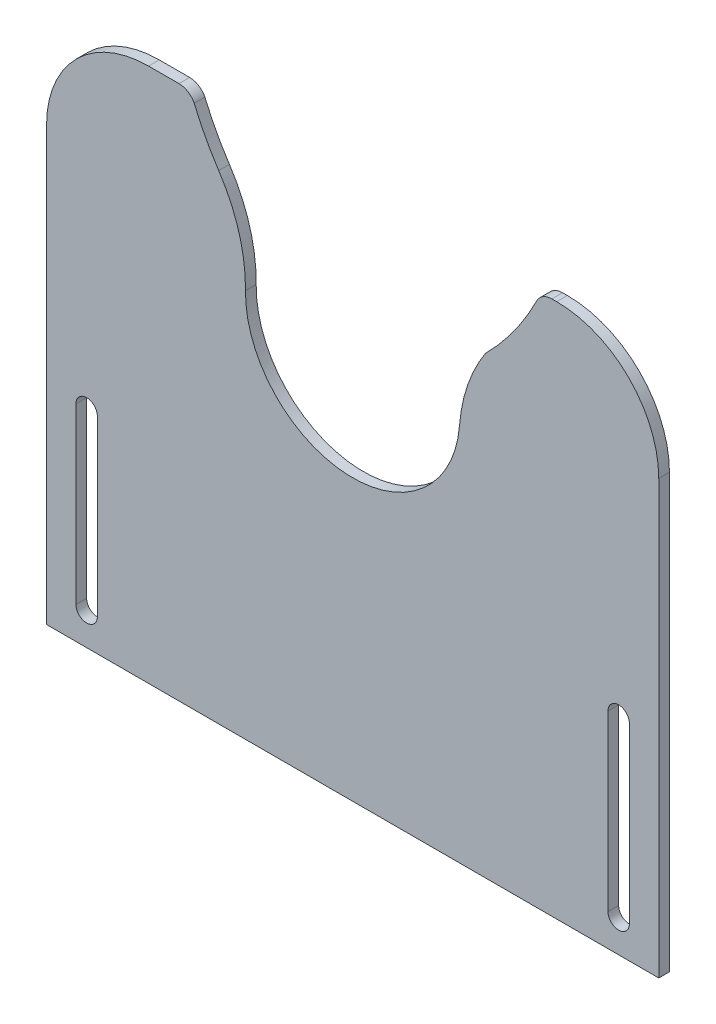
ISO-10303-21;
HEADER;
FILE_DESCRIPTION(('STEP AP214'),'2;1');
FILE_NAME('part.step','',(''),(''),'','','');
FILE_SCHEMA(('AUTOMOTIVE_DESIGN { 1 0 10303 214 1 1 1 1 }'));
ENDSEC;
DATA;
#1=APPLICATION_CONTEXT('core data for automotive mechanical design processes');
#2=APPLICATION_PROTOCOL_DEFINITION('international standard','automotive_design',2000,#1);
#3=PRODUCT_CONTEXT('',#1,'mechanical');
#4=PRODUCT('Part','Part','',(#3));
#5=PRODUCT_RELATED_PRODUCT_CATEGORY('part','',(#4));
#6=PRODUCT_DEFINITION_FORMATION('','',#4);
#7=PRODUCT_DEFINITION_CONTEXT('part definition',#1,'design');
#8=PRODUCT_DEFINITION('design','',#6,#7);
#9=PRODUCT_DEFINITION_SHAPE('','',#8);
#10=(LENGTH_UNIT() NAMED_UNIT(*) SI_UNIT(.MILLI.,.METRE.));
#11=(NAMED_UNIT(*) PLANE_ANGLE_UNIT() SI_UNIT($,.RADIAN.));
#12=(NAMED_UNIT(*) SI_UNIT($,.STERADIAN.) SOLID_ANGLE_UNIT());
#13=UNCERTAINTY_MEASURE_WITH_UNIT(LENGTH_MEASURE(1.E-05),#10,'distance_accuracy_value','');
#14=(GEOMETRIC_REPRESENTATION_CONTEXT(3) GLOBAL_UNCERTAINTY_ASSIGNED_CONTEXT((#13)) GLOBAL_UNIT_ASSIGNED_CONTEXT((#10,
#11,#12)) REPRESENTATION_CONTEXT('',''));
#15=CARTESIAN_POINT('',(0.,0.,0.));
#16=DIRECTION('',(0.,0.,1.));
#17=DIRECTION('',(1.,0.,0.));
#18=AXIS2_PLACEMENT_3D('',#15,#16,#17);
#19=CARTESIAN_POINT('',(76.3333333333333,28.1230553451277,4.));
#20=DIRECTION('',(0.,0.,-1.));
#21=DIRECTION('',(-1.,0.,0.));
#22=AXIS2_PLACEMENT_3D('',#19,#20,#21);
#23=CYLINDRICAL_SURFACE('',#22,38.1666666666667);
#24=CARTESIAN_POINT('',(76.3333333333333,28.1230553451277,0.));
#25=DIRECTION('',(0.,0.,1.));
#26=DIRECTION('',(1.,0.,0.));
#27=AXIS2_PLACEMENT_3D('',#24,#25,#26);
#28=CIRCLE('',#27,38.1666666666667);
#29=CARTESIAN_POINT('',(114.5,28.1230553451277,0.));
#30=VERTEX_POINT('',#29);
#31=CARTESIAN_POINT('',(76.3333284687407,66.2897220117941,0.));
#32=VERTEX_POINT('',#31);
#33=EDGE_CURVE('E216',#30,#32,#28,.T.);
#34=ORIENTED_EDGE('',*,*,#33,.T.);
#35=DIRECTION('',(0.,0.,-1.));
#36=VECTOR('',#35,1.);
#37=CARTESIAN_POINT('',(76.3333284687407,66.2897220117941,4.));
#38=LINE('',#37,#36);
#39=CARTESIAN_POINT('',(76.3333284687407,66.2897220117941,4.));
#40=VERTEX_POINT('',#39);
#41=EDGE_CURVE('E316',#40,#32,#38,.T.);
#42=ORIENTED_EDGE('',*,*,#41,.F.);
#43=CARTESIAN_POINT('',(76.3333333333333,28.1230553451277,4.));
#44=DIRECTION('',(0.,0.,1.));
#45=DIRECTION('',(1.,0.,0.));
#46=AXIS2_PLACEMENT_3D('',#43,#44,#45);
#47=CIRCLE('',#46,38.1666666666667);
#48=CARTESIAN_POINT('',(114.5,28.1230553451277,4.));
#49=VERTEX_POINT('',#48);
#50=EDGE_CURVE('E240',#49,#40,#47,.T.);
#51=ORIENTED_EDGE('',*,*,#50,.F.);
#52=DIRECTION('',(0.,0.,-1.));
#53=VECTOR('',#52,1.);
#54=CARTESIAN_POINT('',(114.5,28.1230553451277,4.));
#55=LINE('',#54,#53);
#56=EDGE_CURVE('E264',#49,#30,#55,.T.);
#57=ORIENTED_EDGE('',*,*,#56,.T.);
#58=EDGE_LOOP('',(#34,#42,#51,#57));
#59=FACE_BOUND('',#58,.T.);
#60=ADVANCED_FACE('F35',(#59),#23,.T.);
#61=CARTESIAN_POINT('',(76.3333284687407,66.2897220117941,4.));
#62=DIRECTION('',(0.,-1.,0.));
#63=DIRECTION('',(0.,0.,-1.));
#64=AXIS2_PLACEMENT_3D('',#61,#62,#63);
#65=PLANE('',#64);
#66=DIRECTION('',(-1.,0.,0.));
#67=VECTOR('',#66,1.);
#68=CARTESIAN_POINT('',(76.3333284687407,66.2897220117941,0.));
#69=LINE('',#68,#67);
#70=CARTESIAN_POINT('',(74.5052518625463,66.2897220117941,0.));
#71=VERTEX_POINT('',#70);
#72=EDGE_CURVE('E267',#32,#71,#69,.T.);
#73=ORIENTED_EDGE('',*,*,#72,.T.);
#74=DIRECTION('',(0.,0.,-1.));
#75=VECTOR('',#74,1.);
#76=CARTESIAN_POINT('',(74.5052518625463,66.2897220117941,4.));
#77=LINE('',#76,#75);
#78=CARTESIAN_POINT('',(74.5052518625463,66.2897220117941,4.));
#79=VERTEX_POINT('',#78);
#80=EDGE_CURVE('E313',#79,#71,#77,.T.);
#81=ORIENTED_EDGE('',*,*,#80,.F.);
#82=DIRECTION('',(-1.,0.,0.));
#83=VECTOR('',#82,1.);
#84=CARTESIAN_POINT('',(76.3333284687407,66.2897220117941,4.));
#85=LINE('',#84,#83);
#86=EDGE_CURVE('E243',#40,#79,#85,.T.);
#87=ORIENTED_EDGE('',*,*,#86,.F.);
#88=ORIENTED_EDGE('',*,*,#41,.T.);
#89=EDGE_LOOP('',(#73,#81,#87,#88));
#90=FACE_BOUND('',#89,.T.);
#91=ADVANCED_FACE('F372',(#90),#65,.F.);
#92=CARTESIAN_POINT('',(74.5052518625463,59.928610900683,4.));
#93=DIRECTION('',(0.,0.,-1.));
#94=DIRECTION('',(-1.,0.,0.));
#95=AXIS2_PLACEMENT_3D('',#92,#93,#94);
#96=CYLINDRICAL_SURFACE('',#95,6.36111111111112);
#97=CARTESIAN_POINT('',(74.5052518625463,59.928610900683,0.));
#98=DIRECTION('',(0.,0.,1.));
#99=DIRECTION('',(1.,0.,0.));
#100=AXIS2_PLACEMENT_3D('',#97,#98,#99);
#101=CIRCLE('',#100,6.36111111111112);
#102=CARTESIAN_POINT('',(68.8157029090702,62.7733898506017,0.));
#103=VERTEX_POINT('',#102);
#104=EDGE_CURVE('E269',#71,#103,#101,.T.);
#105=ORIENTED_EDGE('',*,*,#104,.T.);
#106=DIRECTION('',(0.,0.,-1.));
#107=VECTOR('',#106,1.);
#108=CARTESIAN_POINT('',(68.8157029090702,62.7733898506017,4.));
#109=LINE('',#108,#107);
#110=CARTESIAN_POINT('',(68.8157029090702,62.7733898506017,4.));
#111=VERTEX_POINT('',#110);
#112=EDGE_CURVE('E310',#111,#103,#109,.T.);
#113=ORIENTED_EDGE('',*,*,#112,.F.);
#114=CARTESIAN_POINT('',(74.5052518625463,59.928610900683,4.));
#115=DIRECTION('',(0.,0.,1.));
#116=DIRECTION('',(1.,0.,0.));
#117=AXIS2_PLACEMENT_3D('',#114,#115,#116);
#118=CIRCLE('',#117,6.36111111111112);
#119=EDGE_CURVE('E246',#79,#111,#118,.T.);
#120=ORIENTED_EDGE('',*,*,#119,.F.);
#121=ORIENTED_EDGE('',*,*,#80,.T.);
#122=EDGE_LOOP('',(#105,#113,#120,#121));
#123=FACE_BOUND('',#122,.T.);
#124=ADVANCED_FACE('F368',(#123),#96,.T.);
#125=CARTESIAN_POINT('',(-22.2170803465471,108.289853049303,4.));
#126=DIRECTION('',(0.,0.,-1.));
#127=DIRECTION('',(-1.,0.,0.));
#128=AXIS2_PLACEMENT_3D('',#125,#126,#127);
#129=CYLINDRICAL_SURFACE('',#128,101.777777777779);
#130=CARTESIAN_POINT('',(-22.2170803465471,108.289853049303,0.));
#131=DIRECTION('',(0.,0.,-1.));
#132=DIRECTION('',(1.,0.,0.));
#133=AXIS2_PLACEMENT_3D('',#130,#131,#132);
#134=CIRCLE('',#133,101.777777777779);
#135=CARTESIAN_POINT('',(49.7506764942186,36.3220962085389,0.));
#136=VERTEX_POINT('',#135);
#137=EDGE_CURVE('E271',#103,#136,#134,.T.);
#138=ORIENTED_EDGE('',*,*,#137,.T.);
#139=DIRECTION('',(0.,0.,-1.));
#140=VECTOR('',#139,1.);
#141=CARTESIAN_POINT('',(49.7506764942186,36.3220962085389,4.));
#142=LINE('',#141,#140);
#143=CARTESIAN_POINT('',(49.7506764942186,36.3220962085389,4.));
#144=VERTEX_POINT('',#143);
#145=EDGE_CURVE('E307',#144,#136,#142,.T.);
#146=ORIENTED_EDGE('',*,*,#145,.F.);
#147=CARTESIAN_POINT('',(-22.2170803465471,108.289853049303,4.));
#148=DIRECTION('',(0.,0.,-1.));
#149=DIRECTION('',(1.,0.,0.));
#150=AXIS2_PLACEMENT_3D('',#147,#148,#149);
#151=CIRCLE('',#150,101.777777777779);
#152=EDGE_CURVE('E248',#111,#144,#151,.T.);
#153=ORIENTED_EDGE('',*,*,#152,.F.);
#154=ORIENTED_EDGE('',*,*,#112,.T.);
#155=EDGE_LOOP('',(#138,#146,#153,#154));
#156=FACE_BOUND('',#155,.T.);
#157=ADVANCED_FACE('F363',(#156),#129,.F.);
#158=CARTESIAN_POINT('',(34.7025783160391,101.851646896905,4.));
#159=DIRECTION('',(0.,0.,-1.));
#160=DIRECTION('',(-1.,0.,0.));
#161=AXIS2_PLACEMENT_3D('',#158,#159,#160);
#162=CYLINDRICAL_SURFACE('',#161,101.777777777777);
#163=CARTESIAN_POINT('',(34.7025783160391,101.851646896905,4.));
#164=DIRECTION('',(0.,0.,-1.));
#165=DIRECTION('',(1.,0.,0.));
#166=AXIS2_PLACEMENT_3D('',#163,#164,#165);
#167=CIRCLE('',#166,101.777777777777);
#168=CARTESIAN_POINT('',(-50.0945508826811,45.5652104398137,4.));
#169=VERTEX_POINT('',#168);
#170=CARTESIAN_POINT('',(-59.2740458628787,62.7733900612031,4.));
#171=VERTEX_POINT('',#170);
#172=EDGE_CURVE('E250',#169,#171,#167,.T.);
#173=ORIENTED_EDGE('',*,*,#172,.F.);
#174=DIRECTION('',(0.,0.,-1.));
#175=VECTOR('',#174,1.);
#176=CARTESIAN_POINT('',(-50.0945508826811,45.5652104398137,4.));
#177=LINE('',#176,#175);
#178=CARTESIAN_POINT('',(-50.0945508826811,45.5652104398137,0.));
#179=VERTEX_POINT('',#178);
#180=EDGE_CURVE('E343',#169,#179,#177,.T.);
#181=ORIENTED_EDGE('',*,*,#180,.T.);
#182=CARTESIAN_POINT('',(34.7025783160391,101.851646896905,0.));
#183=DIRECTION('',(0.,0.,-1.));
#184=DIRECTION('',(1.,0.,0.));
#185=AXIS2_PLACEMENT_3D('',#182,#183,#184);
#186=CIRCLE('',#185,101.777777777777);
#187=CARTESIAN_POINT('',(-59.2740458628787,62.7733900612031,0.));
#188=VERTEX_POINT('',#187);
#189=EDGE_CURVE('E274',#179,#188,#186,.T.);
#190=ORIENTED_EDGE('',*,*,#189,.T.);
#191=DIRECTION('',(0.,0.,-1.));
#192=VECTOR('',#191,1.);
#193=CARTESIAN_POINT('',(-59.2740458628787,62.7733900612031,4.));
#194=LINE('',#193,#192);
#195=EDGE_CURVE('E304',#171,#188,#194,.T.);
#196=ORIENTED_EDGE('',*,*,#195,.F.);
#197=EDGE_LOOP('',(#173,#181,#190,#196));
#198=FACE_BOUND('',#197,.T.);
#199=ADVANCED_FACE('F409',(#198),#162,.F.);
#200=CARTESIAN_POINT('',(-64.9635947110538,59.9286109006831,4.));
#201=DIRECTION('',(0.,0.,-1.));
#202=DIRECTION('',(-1.,0.,0.));
#203=AXIS2_PLACEMENT_3D('',#200,#201,#202);
#204=CYLINDRICAL_SURFACE('',#203,6.36111111111103);
#205=CARTESIAN_POINT('',(-64.9635947110538,59.9286109006831,0.));
#206=DIRECTION('',(0.,0.,1.));
#207=DIRECTION('',(1.,0.,0.));
#208=AXIS2_PLACEMENT_3D('',#205,#206,#207);
#209=CIRCLE('',#208,6.36111111111103);
#210=CARTESIAN_POINT('',(-64.9635947110538,66.2897220117941,0.));
#211=VERTEX_POINT('',#210);
#212=EDGE_CURVE('E276',#188,#211,#209,.T.);
#213=ORIENTED_EDGE('',*,*,#212,.T.);
#214=DIRECTION('',(0.,0.,-1.));
#215=VECTOR('',#214,1.);
#216=CARTESIAN_POINT('',(-64.9635947110538,66.2897220117941,4.));
#217=LINE('',#216,#215);
#218=CARTESIAN_POINT('',(-64.9635947110538,66.2897220117941,4.));
#219=VERTEX_POINT('',#218);
#220=EDGE_CURVE('E301',#219,#211,#217,.T.);
#221=ORIENTED_EDGE('',*,*,#220,.F.);
#222=CARTESIAN_POINT('',(-64.9635947110538,59.9286109006831,4.));
#223=DIRECTION('',(0.,0.,1.));
#224=DIRECTION('',(1.,0.,0.));
#225=AXIS2_PLACEMENT_3D('',#222,#223,#224);
#226=CIRCLE('',#225,6.36111111111103);
#227=EDGE_CURVE('E252',#171,#219,#226,.T.);
#228=ORIENTED_EDGE('',*,*,#227,.F.);
#229=ORIENTED_EDGE('',*,*,#195,.T.);
#230=EDGE_LOOP('',(#213,#221,#228,#229));
#231=FACE_BOUND('',#230,.T.);
#232=ADVANCED_FACE('F405',(#231),#204,.T.);
#233=CARTESIAN_POINT('',(-64.9635947110538,66.2897220117941,4.));
#234=DIRECTION('',(0.,-1.,0.));
#235=DIRECTION('',(0.,0.,-1.));
#236=AXIS2_PLACEMENT_3D('',#233,#234,#235);
#237=PLANE('',#236);
#238=DIRECTION('',(-1.,0.,0.));
#239=VECTOR('',#238,1.);
#240=CARTESIAN_POINT('',(-64.9635947110538,66.2897220117941,0.));
#241=LINE('',#240,#239);
#242=CARTESIAN_POINT('',(-76.3333368066178,66.2897220117941,0.));
#243=VERTEX_POINT('',#242);
#244=EDGE_CURVE('E278',#211,#243,#241,.T.);
#245=ORIENTED_EDGE('',*,*,#244,.T.);
#246=DIRECTION('',(0.,0.,-1.));
#247=VECTOR('',#246,1.);
#248=CARTESIAN_POINT('',(-76.3333368066178,66.2897220117941,4.));
#249=LINE('',#248,#247);
#250=CARTESIAN_POINT('',(-76.3333368066178,66.2897220117941,4.));
#251=VERTEX_POINT('',#250);
#252=EDGE_CURVE('E298',#251,#243,#249,.T.);
#253=ORIENTED_EDGE('',*,*,#252,.F.);
#254=DIRECTION('',(-1.,0.,0.));
#255=VECTOR('',#254,1.);
#256=CARTESIAN_POINT('',(-64.9635947110538,66.2897220117941,4.));
#257=LINE('',#256,#255);
#258=EDGE_CURVE('E254',#219,#251,#257,.T.);
#259=ORIENTED_EDGE('',*,*,#258,.F.);
#260=ORIENTED_EDGE('',*,*,#220,.T.);
#261=EDGE_LOOP('',(#245,#253,#259,#260));
#262=FACE_BOUND('',#261,.T.);
#263=ADVANCED_FACE('F401',(#262),#237,.F.);
#264=CARTESIAN_POINT('',(-76.3333333333334,28.1230553451276,4.));
#265=DIRECTION('',(0.,0.,-1.));
#266=DIRECTION('',(-1.,0.,0.));
#267=AXIS2_PLACEMENT_3D('',#264,#265,#266);
#268=CYLINDRICAL_SURFACE('',#267,38.1666666666666);
#269=CARTESIAN_POINT('',(-76.3333333333334,28.1230553451276,0.));
#270=DIRECTION('',(0.,0.,1.));
#271=DIRECTION('',(1.,0.,0.));
#272=AXIS2_PLACEMENT_3D('',#269,#270,#271);
#273=CIRCLE('',#272,38.1666666666666);
#274=CARTESIAN_POINT('',(-114.5,28.1230553451276,0.));
#275=VERTEX_POINT('',#274);
#276=EDGE_CURVE('E280',#243,#275,#273,.T.);
#277=ORIENTED_EDGE('',*,*,#276,.T.);
#278=DIRECTION('',(0.,0.,-1.));
#279=VECTOR('',#278,1.);
#280=CARTESIAN_POINT('',(-114.5,28.1230553451276,4.));
#281=LINE('',#280,#279);
#282=CARTESIAN_POINT('',(-114.5,28.1230553451276,4.));
#283=VERTEX_POINT('',#282);
#284=EDGE_CURVE('E295',#283,#275,#281,.T.);
#285=ORIENTED_EDGE('',*,*,#284,.F.);
#286=CARTESIAN_POINT('',(-76.3333333333334,28.1230553451276,4.));
#287=DIRECTION('',(0.,0.,1.));
#288=DIRECTION('',(1.,0.,0.));
#289=AXIS2_PLACEMENT_3D('',#286,#287,#288);
#290=CIRCLE('',#289,38.1666666666666);
#291=EDGE_CURVE('E256',#251,#283,#290,.T.);
#292=ORIENTED_EDGE('',*,*,#291,.F.);
#293=ORIENTED_EDGE('',*,*,#252,.T.);
#294=EDGE_LOOP('',(#277,#285,#292,#293));
#295=FACE_BOUND('',#294,.T.);
#296=ADVANCED_FACE('F396',(#295),#268,.T.);
#297=CARTESIAN_POINT('',(-114.5,28.1230553451276,4.));
#298=DIRECTION('',(1.,0.,0.));
#299=DIRECTION('',(0.,1.,0.));
#300=AXIS2_PLACEMENT_3D('',#297,#298,#299);
#301=PLANE('',#300);
#302=DIRECTION('',(0.,-1.,0.));
#303=VECTOR('',#302,1.);
#304=CARTESIAN_POINT('',(-114.5,28.1230553451276,0.));
#305=LINE('',#304,#303);
#306=CARTESIAN_POINT('',(-114.5,-133.710277988206,0.));
#307=VERTEX_POINT('',#306);
#308=EDGE_CURVE('E282',#275,#307,#305,.T.);
#309=ORIENTED_EDGE('',*,*,#308,.T.);
#310=DIRECTION('',(0.,0.,-1.));
#311=VECTOR('',#310,1.);
#312=CARTESIAN_POINT('',(-114.5,-133.710277988206,4.));
#313=LINE('',#312,#311);
#314=CARTESIAN_POINT('',(-114.5,-133.710277988206,4.));
#315=VERTEX_POINT('',#314);
#316=EDGE_CURVE('E292',#315,#307,#313,.T.);
#317=ORIENTED_EDGE('',*,*,#316,.F.);
#318=DIRECTION('',(0.,-1.,0.));
#319=VECTOR('',#318,1.);
#320=CARTESIAN_POINT('',(-114.5,28.1230553451276,4.));
#321=LINE('',#320,#319);
#322=EDGE_CURVE('E258',#283,#315,#321,.T.);
#323=ORIENTED_EDGE('',*,*,#322,.F.);
#324=ORIENTED_EDGE('',*,*,#284,.T.);
#325=EDGE_LOOP('',(#309,#317,#323,#324));
#326=FACE_BOUND('',#325,.T.);
#327=ADVANCED_FACE('F390',(#326),#301,.F.);
#328=CARTESIAN_POINT('',(-114.5,-133.710277988206,4.));
#329=DIRECTION('',(0.,1.,0.));
#330=DIRECTION('',(0.,0.,1.));
#331=AXIS2_PLACEMENT_3D('',#328,#329,#330);
#332=PLANE('',#331);
#333=DIRECTION('',(1.,0.,0.));
#334=VECTOR('',#333,1.);
#335=CARTESIAN_POINT('',(-114.5,-133.710277988206,0.));
#336=LINE('',#335,#334);
#337=CARTESIAN_POINT('',(114.5,-133.710277988206,0.));
#338=VERTEX_POINT('',#337);
#339=EDGE_CURVE('E284',#307,#338,#336,.T.);
#340=ORIENTED_EDGE('',*,*,#339,.T.);
#341=DIRECTION('',(0.,0.,-1.));
#342=VECTOR('',#341,1.);
#343=CARTESIAN_POINT('',(114.5,-133.710277988206,4.));
#344=LINE('',#343,#342);
#345=CARTESIAN_POINT('',(114.5,-133.710277988206,4.));
#346=VERTEX_POINT('',#345);
#347=EDGE_CURVE('E289',#346,#338,#344,.T.);
#348=ORIENTED_EDGE('',*,*,#347,.F.);
#349=DIRECTION('',(1.,0.,0.));
#350=VECTOR('',#349,1.);
#351=CARTESIAN_POINT('',(-114.5,-133.710277988206,4.));
#352=LINE('',#351,#350);
#353=EDGE_CURVE('E260',#315,#346,#352,.T.);
#354=ORIENTED_EDGE('',*,*,#353,.F.);
#355=ORIENTED_EDGE('',*,*,#316,.T.);
#356=EDGE_LOOP('',(#340,#348,#354,#355));
#357=FACE_BOUND('',#356,.T.);
#358=ADVANCED_FACE('F386',(#357),#332,.F.);
#359=CARTESIAN_POINT('',(114.5,-133.710277988206,4.));
#360=DIRECTION('',(-1.,0.,0.));
#361=DIRECTION('',(0.,-1.,0.));
#362=AXIS2_PLACEMENT_3D('',#359,#360,#361);
#363=PLANE('',#362);
#364=DIRECTION('',(0.,1.,0.));
#365=VECTOR('',#364,1.);
#366=CARTESIAN_POINT('',(114.5,-133.710277988206,0.));
#367=LINE('',#366,#365);
#368=EDGE_CURVE('E244',#338,#30,#367,.T.);
#369=ORIENTED_EDGE('',*,*,#368,.T.);
#370=ORIENTED_EDGE('',*,*,#56,.F.);
#371=DIRECTION('',(0.,1.,0.));
#372=VECTOR('',#371,1.);
#373=CARTESIAN_POINT('',(114.5,-133.710277988206,4.));
#374=LINE('',#373,#372);
#375=EDGE_CURVE('E262',#346,#49,#374,.T.);
#376=ORIENTED_EDGE('',*,*,#375,.F.);
#377=ORIENTED_EDGE('',*,*,#347,.T.);
#378=EDGE_LOOP('',(#369,#370,#376,#377));
#379=FACE_BOUND('',#378,.T.);
#380=ADVANCED_FACE('F381',(#379),#363,.F.);
#381=CARTESIAN_POINT('',(76.3333333333333,28.1230553451277,4.));
#382=DIRECTION('',(0.,0.,1.));
#383=DIRECTION('',(1.,0.,0.));
#384=AXIS2_PLACEMENT_3D('',#381,#382,#383);
#385=PLANE('',#384);
#386=CARTESIAN_POINT('',(-1.21616608461713E-06,11.1658275297556,4.));
#387=DIRECTION('',(0.,0.,1.));
#388=DIRECTION('',(1.,0.,0.));
#389=AXIS2_PLACEMENT_3D('',#386,#387,#388);
#390=CIRCLE('',#389,40.09152773397);
#391=CARTESIAN_POINT('',(-40.0885632535085,11.6534645072589,4.));
#392=VERTEX_POINT('',#391);
#393=CARTESIAN_POINT('',(39.9640342405793,7.97107150531764,4.));
#394=VERTEX_POINT('',#393);
#395=EDGE_CURVE('E222',#392,#394,#390,.T.);
#396=ORIENTED_EDGE('',*,*,#395,.F.);
#397=CARTESIAN_POINT('',(-100.08412486446,12.3832500830129,4.));
#398=DIRECTION('',(0.,0.,1.));
#399=DIRECTION('',(1.,0.,0.));
#400=AXIS2_PLACEMENT_3D('',#397,#398,#399);
#401=CIRCLE('',#400,60.);
#402=EDGE_CURVE('E11',#392,#169,#401,.T.);
#403=ORIENTED_EDGE('',*,*,#402,.T.);
#404=ORIENTED_EDGE('',*,*,#172,.T.);
#405=ORIENTED_EDGE('',*,*,#227,.T.);
#406=ORIENTED_EDGE('',*,*,#258,.T.);
#407=ORIENTED_EDGE('',*,*,#291,.T.);
#408=ORIENTED_EDGE('',*,*,#322,.T.);
#409=ORIENTED_EDGE('',*,*,#353,.T.);
#410=ORIENTED_EDGE('',*,*,#375,.T.);
#411=ORIENTED_EDGE('',*,*,#50,.T.);
#412=ORIENTED_EDGE('',*,*,#86,.T.);
#413=ORIENTED_EDGE('',*,*,#119,.T.);
#414=ORIENTED_EDGE('',*,*,#152,.T.);
#415=CARTESIAN_POINT('',(99.7732324162079,3.18987776438011,4.));
#416=DIRECTION('',(0.,0.,1.));
#417=DIRECTION('',(1.,0.,0.));
#418=AXIS2_PLACEMENT_3D('',#415,#416,#417);
#419=CIRCLE('',#418,60.);
#420=EDGE_CURVE('E43',#144,#394,#419,.T.);
#421=ORIENTED_EDGE('',*,*,#420,.T.);
#422=EDGE_LOOP('',(#396,#403,#404,#405,#406,#407,#408,#409,#410,#411,#412,#413,#414,#421));
#423=FACE_BOUND('',#422,.T.);
#424=CARTESIAN_POINT('',(-99.5000015693326,-56.7102779882059,4.));
#425=DIRECTION('',(0.,0.,1.));
#426=DIRECTION('',(1.,0.,0.));
#427=AXIS2_PLACEMENT_3D('',#424,#425,#426);
#428=CIRCLE('',#427,4.);
#429=CARTESIAN_POINT('',(-95.5000015693327,-56.7102779882059,4.));
#430=VERTEX_POINT('',#429);
#431=CARTESIAN_POINT('',(-103.500001569333,-56.7102779882059,4.));
#432=VERTEX_POINT('',#431);
#433=EDGE_CURVE('E204',#430,#432,#428,.T.);
#434=ORIENTED_EDGE('',*,*,#433,.F.);
#435=DIRECTION('',(0.,1.,0.));
#436=VECTOR('',#435,1.);
#437=CARTESIAN_POINT('',(-95.5000015693327,-56.7102779882059,4.));
#438=LINE('',#437,#436);
#439=CARTESIAN_POINT('',(-95.5000015693327,-121.710277988206,4.));
#440=VERTEX_POINT('',#439);
#441=EDGE_CURVE('E209',#440,#430,#438,.T.);
#442=ORIENTED_EDGE('',*,*,#441,.F.);
#443=CARTESIAN_POINT('',(-99.5000015693326,-121.710277988206,4.));
#444=DIRECTION('',(0.,0.,1.));
#445=DIRECTION('',(1.,0.,0.));
#446=AXIS2_PLACEMENT_3D('',#443,#444,#445);
#447=CIRCLE('',#446,3.99999999999996);
#448=CARTESIAN_POINT('',(-103.500001569333,-121.710277988206,4.));
#449=VERTEX_POINT('',#448);
#450=EDGE_CURVE('E188',#449,#440,#447,.T.);
#451=ORIENTED_EDGE('',*,*,#450,.F.);
#452=DIRECTION('',(0.,-1.,0.));
#453=VECTOR('',#452,1.);
#454=CARTESIAN_POINT('',(-103.500001569333,-56.7102779882059,4.));
#455=LINE('',#454,#453);
#456=EDGE_CURVE('E199',#432,#449,#455,.T.);
#457=ORIENTED_EDGE('',*,*,#456,.F.);
#458=EDGE_LOOP('',(#434,#442,#451,#457));
#459=FACE_BOUND('',#458,.T.);
#460=CARTESIAN_POINT('',(99.5000015693326,-56.7102779882059,4.));
#461=DIRECTION('',(0.,0.,1.));
#462=DIRECTION('',(-1.,0.,0.));
#463=AXIS2_PLACEMENT_3D('',#460,#461,#462);
#464=CIRCLE('',#463,4.);
#465=CARTESIAN_POINT('',(103.500001569333,-56.7102779882059,4.));
#466=VERTEX_POINT('',#465);
#467=CARTESIAN_POINT('',(95.5000015693327,-56.7102779882059,4.));
#468=VERTEX_POINT('',#467);
#469=EDGE_CURVE('E219',#466,#468,#464,.T.);
#470=ORIENTED_EDGE('',*,*,#469,.F.);
#471=DIRECTION('',(0.,1.,0.));
#472=VECTOR('',#471,1.);
#473=CARTESIAN_POINT('',(103.500001569333,-56.7102779882059,4.));
#474=LINE('',#473,#472);
#475=CARTESIAN_POINT('',(103.500001569333,-121.710277988206,4.));
#476=VERTEX_POINT('',#475);
#477=EDGE_CURVE('E228',#476,#466,#474,.T.);
#478=ORIENTED_EDGE('',*,*,#477,.F.);
#479=CARTESIAN_POINT('',(99.5000015693326,-121.710277988206,4.));
#480=DIRECTION('',(0.,0.,1.));
#481=DIRECTION('',(-1.,0.,0.));
#482=AXIS2_PLACEMENT_3D('',#479,#480,#481);
#483=CIRCLE('',#482,3.99999999999996);
#484=CARTESIAN_POINT('',(95.5000015693327,-121.710277988206,4.));
#485=VERTEX_POINT('',#484);
#486=EDGE_CURVE('E225',#485,#476,#483,.T.);
#487=ORIENTED_EDGE('',*,*,#486,.F.);
#488=DIRECTION('',(0.,-1.,0.));
#489=VECTOR('',#488,1.);
#490=CARTESIAN_POINT('',(95.5000015693327,-56.7102779882059,4.));
#491=LINE('',#490,#489);
#492=EDGE_CURVE('E221',#468,#485,#491,.T.);
#493=ORIENTED_EDGE('',*,*,#492,.F.);
#494=EDGE_LOOP('',(#470,#478,#487,#493));
#495=FACE_BOUND('',#494,.T.);
#496=ADVANCED_FACE('F206',(#423,#459,#495),#385,.T.);
#497=CARTESIAN_POINT('',(76.3333333333333,28.1230553451277,0.));
#498=DIRECTION('',(0.,0.,1.));
#499=DIRECTION('',(1.,0.,0.));
#500=AXIS2_PLACEMENT_3D('',#497,#498,#499);
#501=PLANE('',#500);
#502=DIRECTION('',(0.,1.,0.));
#503=VECTOR('',#502,1.);
#504=CARTESIAN_POINT('',(-95.5000015693326,28.1230553451279,0.));
#505=LINE('',#504,#503);
#506=CARTESIAN_POINT('',(-95.5000015693327,-121.710277988206,0.));
#507=VERTEX_POINT('',#506);
#508=CARTESIAN_POINT('',(-95.5000015693327,-56.7102779882059,0.));
#509=VERTEX_POINT('',#508);
#510=EDGE_CURVE('E334',#507,#509,#505,.T.);
#511=ORIENTED_EDGE('',*,*,#510,.T.);
#512=CARTESIAN_POINT('',(-99.5000015693326,-56.7102779882059,0.));
#513=DIRECTION('',(0.,0.,1.));
#514=DIRECTION('',(1.,0.,0.));
#515=AXIS2_PLACEMENT_3D('',#512,#513,#514);
#516=CIRCLE('',#515,4.);
#517=CARTESIAN_POINT('',(-103.500001569333,-56.7102779882059,0.));
#518=VERTEX_POINT('',#517);
#519=EDGE_CURVE('E337',#509,#518,#516,.T.);
#520=ORIENTED_EDGE('',*,*,#519,.T.);
#521=DIRECTION('',(0.,-1.,0.));
#522=VECTOR('',#521,1.);
#523=CARTESIAN_POINT('',(-103.500001569333,28.1230553451277,0.));
#524=LINE('',#523,#522);
#525=CARTESIAN_POINT('',(-103.500001569333,-121.710277988206,0.));
#526=VERTEX_POINT('',#525);
#527=EDGE_CURVE('E331',#518,#526,#524,.T.);
#528=ORIENTED_EDGE('',*,*,#527,.T.);
#529=CARTESIAN_POINT('',(-99.5000015693326,-121.710277988206,0.));
#530=DIRECTION('',(0.,0.,1.));
#531=DIRECTION('',(1.,0.,0.));
#532=AXIS2_PLACEMENT_3D('',#529,#530,#531);
#533=CIRCLE('',#532,3.99999999999996);
#534=EDGE_CURVE('E191',#526,#507,#533,.T.);
#535=ORIENTED_EDGE('',*,*,#534,.T.);
#536=EDGE_LOOP('',(#511,#520,#528,#535));
#537=FACE_BOUND('',#536,.T.);
#538=DIRECTION('',(0.,1.,0.));
#539=VECTOR('',#538,1.);
#540=CARTESIAN_POINT('',(103.500001569333,28.1230553451277,0.));
#541=LINE('',#540,#539);
#542=CARTESIAN_POINT('',(103.500001569333,-121.710277988206,0.));
#543=VERTEX_POINT('',#542);
#544=CARTESIAN_POINT('',(103.500001569333,-56.7102779882059,0.));
#545=VERTEX_POINT('',#544);
#546=EDGE_CURVE('E325',#543,#545,#541,.T.);
#547=ORIENTED_EDGE('',*,*,#546,.T.);
#548=CARTESIAN_POINT('',(99.5000015693326,-56.7102779882059,0.));
#549=DIRECTION('',(0.,0.,1.));
#550=DIRECTION('',(1.,0.,0.));
#551=AXIS2_PLACEMENT_3D('',#548,#549,#550);
#552=CIRCLE('',#551,4.);
#553=CARTESIAN_POINT('',(95.5000015693327,-56.7102779882059,0.));
#554=VERTEX_POINT('',#553);
#555=EDGE_CURVE('E328',#545,#554,#552,.T.);
#556=ORIENTED_EDGE('',*,*,#555,.T.);
#557=DIRECTION('',(0.,-1.,0.));
#558=VECTOR('',#557,1.);
#559=CARTESIAN_POINT('',(95.5000015693326,28.1230553451278,0.));
#560=LINE('',#559,#558);
#561=CARTESIAN_POINT('',(95.5000015693327,-121.710277988206,0.));
#562=VERTEX_POINT('',#561);
#563=EDGE_CURVE('E319',#554,#562,#560,.T.);
#564=ORIENTED_EDGE('',*,*,#563,.T.);
#565=CARTESIAN_POINT('',(99.5000015693326,-121.710277988206,0.));
#566=DIRECTION('',(0.,0.,1.));
#567=DIRECTION('',(1.,0.,0.));
#568=AXIS2_PLACEMENT_3D('',#565,#566,#567);
#569=CIRCLE('',#568,3.99999999999996);
#570=EDGE_CURVE('E322',#562,#543,#569,.T.);
#571=ORIENTED_EDGE('',*,*,#570,.T.);
#572=EDGE_LOOP('',(#547,#556,#564,#571));
#573=FACE_BOUND('',#572,.T.);
#574=ORIENTED_EDGE('',*,*,#189,.F.);
#575=CARTESIAN_POINT('',(-100.08412486446,12.3832500830129,0.));
#576=DIRECTION('',(0.,0.,1.));
#577=DIRECTION('',(1.,0.,0.));
#578=AXIS2_PLACEMENT_3D('',#575,#576,#577);
#579=CIRCLE('',#578,60.);
#580=CARTESIAN_POINT('',(-40.0885632535085,11.6534645072589,0.));
#581=VERTEX_POINT('',#580);
#582=EDGE_CURVE('E348',#179,#581,#579,.F.);
#583=ORIENTED_EDGE('',*,*,#582,.T.);
#584=CARTESIAN_POINT('',(-1.21616608461713E-06,11.1658275297556,0.));
#585=DIRECTION('',(0.,0.,1.));
#586=DIRECTION('',(1.,0.,0.));
#587=AXIS2_PLACEMENT_3D('',#584,#585,#586);
#588=CIRCLE('',#587,40.09152773397);
#589=CARTESIAN_POINT('',(39.9640342405793,7.97107150531764,0.));
#590=VERTEX_POINT('',#589);
#591=EDGE_CURVE('E340',#581,#590,#588,.T.);
#592=ORIENTED_EDGE('',*,*,#591,.T.);
#593=CARTESIAN_POINT('',(99.7732324162079,3.18987776438011,0.));
#594=DIRECTION('',(0.,0.,1.));
#595=DIRECTION('',(1.,0.,0.));
#596=AXIS2_PLACEMENT_3D('',#593,#594,#595);
#597=CIRCLE('',#596,60.);
#598=EDGE_CURVE('E346',#590,#136,#597,.F.);
#599=ORIENTED_EDGE('',*,*,#598,.T.);
#600=ORIENTED_EDGE('',*,*,#137,.F.);
#601=ORIENTED_EDGE('',*,*,#104,.F.);
#602=ORIENTED_EDGE('',*,*,#72,.F.);
#603=ORIENTED_EDGE('',*,*,#33,.F.);
#604=ORIENTED_EDGE('',*,*,#368,.F.);
#605=ORIENTED_EDGE('',*,*,#339,.F.);
#606=ORIENTED_EDGE('',*,*,#308,.F.);
#607=ORIENTED_EDGE('',*,*,#276,.F.);
#608=ORIENTED_EDGE('',*,*,#244,.F.);
#609=ORIENTED_EDGE('',*,*,#212,.F.);
#610=EDGE_LOOP('',(#574,#583,#592,#599,#600,#601,#602,#603,#604,#605,#606,#607,#608,#609));
#611=FACE_BOUND('',#610,.T.);
#612=ADVANCED_FACE('F358',(#537,#573,#611),#501,.F.);
#613=CARTESIAN_POINT('',(99.5000015693326,-56.7102779882059,-6.));
#614=DIRECTION('',(0.,0.,1.));
#615=DIRECTION('',(1.,0.,0.));
#616=AXIS2_PLACEMENT_3D('',#613,#614,#615);
#617=CYLINDRICAL_SURFACE('',#616,4.);
#618=DIRECTION('',(0.,0.,1.));
#619=VECTOR('',#618,1.);
#620=CARTESIAN_POINT('',(103.500001569333,-56.7102779882059,-6.));
#621=LINE('',#620,#619);
#622=EDGE_CURVE('E232',#545,#466,#621,.T.);
#623=ORIENTED_EDGE('',*,*,#622,.T.);
#624=ORIENTED_EDGE('',*,*,#469,.T.);
#625=DIRECTION('',(0.,0.,1.));
#626=VECTOR('',#625,1.);
#627=CARTESIAN_POINT('',(95.5000015693327,-56.7102779882059,-6.));
#628=LINE('',#627,#626);
#629=EDGE_CURVE('E231',#554,#468,#628,.T.);
#630=ORIENTED_EDGE('',*,*,#629,.F.);
#631=ORIENTED_EDGE('',*,*,#555,.F.);
#632=EDGE_LOOP('',(#623,#624,#630,#631));
#633=FACE_BOUND('',#632,.T.);
#634=ADVANCED_FACE('F423',(#633),#617,.F.);
#635=CARTESIAN_POINT('',(103.500001569333,-56.7102779882059,-6.));
#636=DIRECTION('',(1.,0.,0.));
#637=DIRECTION('',(0.,1.,0.));
#638=AXIS2_PLACEMENT_3D('',#635,#636,#637);
#639=PLANE('',#638);
#640=DIRECTION('',(0.,0.,1.));
#641=VECTOR('',#640,1.);
#642=CARTESIAN_POINT('',(103.500001569333,-121.710277988206,-6.));
#643=LINE('',#642,#641);
#644=EDGE_CURVE('E234',#543,#476,#643,.T.);
#645=ORIENTED_EDGE('',*,*,#644,.T.);
#646=ORIENTED_EDGE('',*,*,#477,.T.);
#647=ORIENTED_EDGE('',*,*,#622,.F.);
#648=ORIENTED_EDGE('',*,*,#546,.F.);
#649=EDGE_LOOP('',(#645,#646,#647,#648));
#650=FACE_BOUND('',#649,.T.);
#651=ADVANCED_FACE('F429',(#650),#639,.F.);
#652=CARTESIAN_POINT('',(99.5000015693326,-121.710277988206,-6.));
#653=DIRECTION('',(0.,0.,1.));
#654=DIRECTION('',(1.,0.,0.));
#655=AXIS2_PLACEMENT_3D('',#652,#653,#654);
#656=CYLINDRICAL_SURFACE('',#655,3.99999999999996);
#657=DIRECTION('',(0.,0.,1.));
#658=VECTOR('',#657,1.);
#659=CARTESIAN_POINT('',(95.5000015693327,-121.710277988206,-6.));
#660=LINE('',#659,#658);
#661=EDGE_CURVE('E236',#562,#485,#660,.T.);
#662=ORIENTED_EDGE('',*,*,#661,.T.);
#663=ORIENTED_EDGE('',*,*,#486,.T.);
#664=ORIENTED_EDGE('',*,*,#644,.F.);
#665=ORIENTED_EDGE('',*,*,#570,.F.);
#666=EDGE_LOOP('',(#662,#663,#664,#665));
#667=FACE_BOUND('',#666,.T.);
#668=ADVANCED_FACE('F431',(#667),#656,.F.);
#669=CARTESIAN_POINT('',(95.5000015693327,-56.7102779882059,-6.));
#670=DIRECTION('',(-1.,0.,0.));
#671=DIRECTION('',(0.,-1.,0.));
#672=AXIS2_PLACEMENT_3D('',#669,#670,#671);
#673=PLANE('',#672);
#674=ORIENTED_EDGE('',*,*,#629,.T.);
#675=ORIENTED_EDGE('',*,*,#492,.T.);
#676=ORIENTED_EDGE('',*,*,#661,.F.);
#677=ORIENTED_EDGE('',*,*,#563,.F.);
#678=EDGE_LOOP('',(#674,#675,#676,#677));
#679=FACE_BOUND('',#678,.T.);
#680=ADVANCED_FACE('F439',(#679),#673,.F.);
#681=CARTESIAN_POINT('',(-99.5000015693326,-56.7102779882059,-6.));
#682=DIRECTION('',(0.,0.,1.));
#683=DIRECTION('',(1.,0.,0.));
#684=AXIS2_PLACEMENT_3D('',#681,#682,#683);
#685=CYLINDRICAL_SURFACE('',#684,4.);
#686=DIRECTION('',(0.,0.,1.));
#687=VECTOR('',#686,1.);
#688=CARTESIAN_POINT('',(-95.5000015693327,-56.7102779882059,-6.));
#689=LINE('',#688,#687);
#690=EDGE_CURVE('E214',#509,#430,#689,.T.);
#691=ORIENTED_EDGE('',*,*,#690,.T.);
#692=ORIENTED_EDGE('',*,*,#433,.T.);
#693=DIRECTION('',(0.,0.,1.));
#694=VECTOR('',#693,1.);
#695=CARTESIAN_POINT('',(-103.500001569333,-56.7102779882059,-6.));
#696=LINE('',#695,#694);
#697=EDGE_CURVE('E195',#518,#432,#696,.T.);
#698=ORIENTED_EDGE('',*,*,#697,.F.);
#699=ORIENTED_EDGE('',*,*,#519,.F.);
#700=EDGE_LOOP('',(#691,#692,#698,#699));
#701=FACE_BOUND('',#700,.T.);
#702=ADVANCED_FACE('F416',(#701),#685,.F.);
#703=CARTESIAN_POINT('',(-95.5000015693327,-56.7102779882059,-6.));
#704=DIRECTION('',(1.,0.,0.));
#705=DIRECTION('',(0.,1.,0.));
#706=AXIS2_PLACEMENT_3D('',#703,#704,#705);
#707=PLANE('',#706);
#708=DIRECTION('',(0.,0.,1.));
#709=VECTOR('',#708,1.);
#710=CARTESIAN_POINT('',(-95.5000015693327,-121.710277988206,-6.));
#711=LINE('',#710,#709);
#712=EDGE_CURVE('E194',#507,#440,#711,.T.);
#713=ORIENTED_EDGE('',*,*,#712,.T.);
#714=ORIENTED_EDGE('',*,*,#441,.T.);
#715=ORIENTED_EDGE('',*,*,#690,.F.);
#716=ORIENTED_EDGE('',*,*,#510,.F.);
#717=EDGE_LOOP('',(#713,#714,#715,#716));
#718=FACE_BOUND('',#717,.T.);
#719=ADVANCED_FACE('F419',(#718),#707,.F.);
#720=CARTESIAN_POINT('',(-99.5000015693326,-121.710277988206,-6.));
#721=DIRECTION('',(0.,0.,1.));
#722=DIRECTION('',(1.,0.,0.));
#723=AXIS2_PLACEMENT_3D('',#720,#721,#722);
#724=CYLINDRICAL_SURFACE('',#723,3.99999999999996);
#725=DIRECTION('',(0.,0.,1.));
#726=VECTOR('',#725,1.);
#727=CARTESIAN_POINT('',(-103.500001569333,-121.710277988206,-6.));
#728=LINE('',#727,#726);
#729=EDGE_CURVE('E183',#526,#449,#728,.T.);
#730=ORIENTED_EDGE('',*,*,#729,.T.);
#731=ORIENTED_EDGE('',*,*,#450,.T.);
#732=ORIENTED_EDGE('',*,*,#712,.F.);
#733=ORIENTED_EDGE('',*,*,#534,.F.);
#734=EDGE_LOOP('',(#730,#731,#732,#733));
#735=FACE_BOUND('',#734,.T.);
#736=ADVANCED_FACE('F185',(#735),#724,.F.);
#737=CARTESIAN_POINT('',(-103.500001569333,-56.7102779882059,-6.));
#738=DIRECTION('',(-1.,0.,0.));
#739=DIRECTION('',(0.,-1.,0.));
#740=AXIS2_PLACEMENT_3D('',#737,#738,#739);
#741=PLANE('',#740);
#742=ORIENTED_EDGE('',*,*,#697,.T.);
#743=ORIENTED_EDGE('',*,*,#456,.T.);
#744=ORIENTED_EDGE('',*,*,#729,.F.);
#745=ORIENTED_EDGE('',*,*,#527,.F.);
#746=EDGE_LOOP('',(#742,#743,#744,#745));
#747=FACE_BOUND('',#746,.T.);
#748=ADVANCED_FACE('F200',(#747),#741,.F.);
#749=CARTESIAN_POINT('',(-1.21616608461713E-06,11.1658275297556,0.));
#750=DIRECTION('',(0.,0.,1.));
#751=DIRECTION('',(1.,0.,0.));
#752=AXIS2_PLACEMENT_3D('',#749,#750,#751);
#753=CYLINDRICAL_SURFACE('',#752,40.09152773397);
#754=ORIENTED_EDGE('',*,*,#591,.F.);
#755=DIRECTION('',(0.,0.,1.));
#756=VECTOR('',#755,1.);
#757=CARTESIAN_POINT('',(-40.0885632535085,11.6534645072589,0.));
#758=LINE('',#757,#756);
#759=EDGE_CURVE('E56',#581,#392,#758,.T.);
#760=ORIENTED_EDGE('',*,*,#759,.T.);
#761=ORIENTED_EDGE('',*,*,#395,.T.);
#762=DIRECTION('',(0.,0.,1.));
#763=VECTOR('',#762,1.);
#764=CARTESIAN_POINT('',(39.9640342405793,7.97107150531764,0.));
#765=LINE('',#764,#763);
#766=EDGE_CURVE('E350',#394,#590,#765,.F.);
#767=ORIENTED_EDGE('',*,*,#766,.T.);
#768=EDGE_LOOP('',(#754,#760,#761,#767));
#769=FACE_BOUND('',#768,.T.);
#770=ADVANCED_FACE('F353',(#769),#753,.F.);
#771=CARTESIAN_POINT('',(-100.08412486446,12.3832500830129,0.));
#772=DIRECTION('',(0.,0.,-1.));
#773=DIRECTION('',(-1.,0.,0.));
#774=AXIS2_PLACEMENT_3D('',#771,#772,#773);
#775=CYLINDRICAL_SURFACE('',#774,60.);
#776=ORIENTED_EDGE('',*,*,#402,.F.);
#777=ORIENTED_EDGE('',*,*,#759,.F.);
#778=ORIENTED_EDGE('',*,*,#582,.F.);
#779=ORIENTED_EDGE('',*,*,#180,.F.);
#780=EDGE_LOOP('',(#776,#777,#778,#779));
#781=FACE_BOUND('',#780,.T.);
#782=ADVANCED_FACE('F413',(#781),#775,.T.);
#783=CARTESIAN_POINT('',(99.7732324162079,3.18987776438011,0.));
#784=DIRECTION('',(0.,0.,1.));
#785=DIRECTION('',(1.,0.,0.));
#786=AXIS2_PLACEMENT_3D('',#783,#784,#785);
#787=CYLINDRICAL_SURFACE('',#786,60.);
#788=ORIENTED_EDGE('',*,*,#598,.F.);
#789=ORIENTED_EDGE('',*,*,#766,.F.);
#790=ORIENTED_EDGE('',*,*,#420,.F.);
#791=ORIENTED_EDGE('',*,*,#145,.T.);
#792=EDGE_LOOP('',(#788,#789,#790,#791));
#793=FACE_BOUND('',#792,.T.);
#794=ADVANCED_FACE('F37',(#793),#787,.T.);
#795=CLOSED_SHELL('',(#60,#91,#124,#157,#199,#232,#263,#296,#327,#358,#380,#496,#612,#634,#651,
#668,#680,#702,#719,#736,#748,#770,#782,#794));
#796=MANIFOLD_SOLID_BREP('B2',#795);
#797=ADVANCED_BREP_SHAPE_REPRESENTATION('',(#18,#796),#14);
#798=SHAPE_DEFINITION_REPRESENTATION(#9,#797);
ENDSEC;
END-ISO-10303-21;
